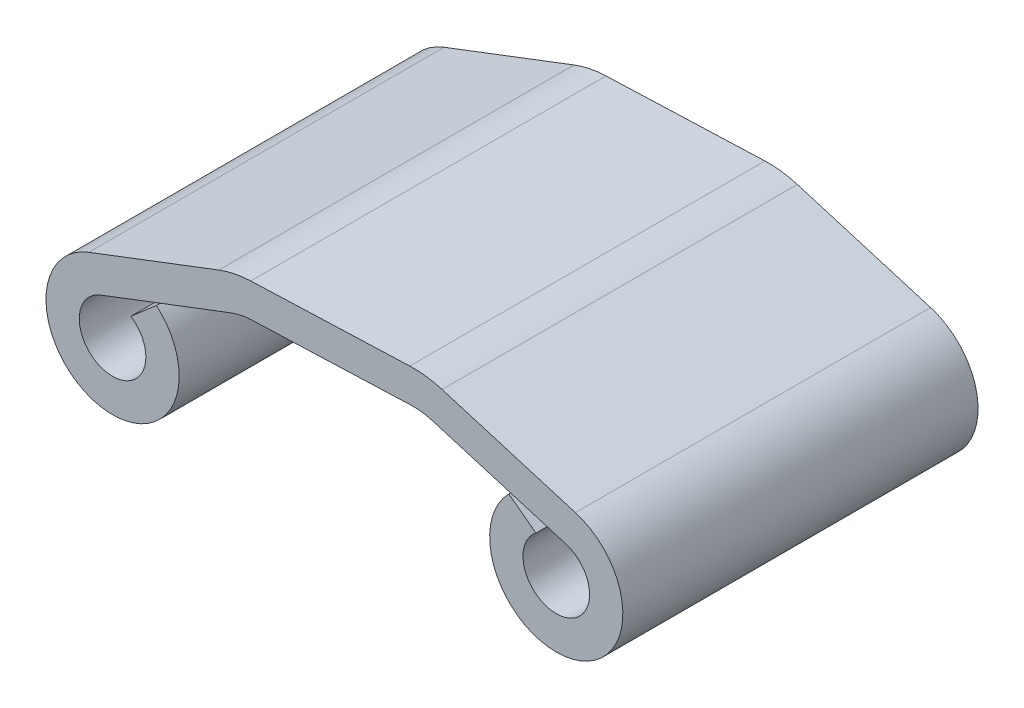
ISO-10303-21;
HEADER;
FILE_DESCRIPTION(('STEP AP214'),'2;1');
FILE_NAME('part.step','',(''),(''),'','','');
FILE_SCHEMA(('AUTOMOTIVE_DESIGN { 1 0 10303 214 1 1 1 1 }'));
ENDSEC;
DATA;
#1=APPLICATION_CONTEXT('core data for automotive mechanical design processes');
#2=APPLICATION_PROTOCOL_DEFINITION('international standard','automotive_design',2000,#1);
#3=PRODUCT_CONTEXT('',#1,'mechanical');
#4=PRODUCT('Part','Part','',(#3));
#5=PRODUCT_RELATED_PRODUCT_CATEGORY('part','',(#4));
#6=PRODUCT_DEFINITION_FORMATION('','',#4);
#7=PRODUCT_DEFINITION_CONTEXT('part definition',#1,'design');
#8=PRODUCT_DEFINITION('design','',#6,#7);
#9=PRODUCT_DEFINITION_SHAPE('','',#8);
#10=(LENGTH_UNIT() NAMED_UNIT(*) SI_UNIT(.MILLI.,.METRE.));
#11=(NAMED_UNIT(*) PLANE_ANGLE_UNIT() SI_UNIT($,.RADIAN.));
#12=(NAMED_UNIT(*) SI_UNIT($,.STERADIAN.) SOLID_ANGLE_UNIT());
#13=UNCERTAINTY_MEASURE_WITH_UNIT(LENGTH_MEASURE(1.E-05),#10,'distance_accuracy_value','');
#14=(GEOMETRIC_REPRESENTATION_CONTEXT(3) GLOBAL_UNCERTAINTY_ASSIGNED_CONTEXT((#13)) GLOBAL_UNIT_ASSIGNED_CONTEXT((#10,
#11,#12)) REPRESENTATION_CONTEXT('',''));
#15=CARTESIAN_POINT('',(0.,0.,0.));
#16=DIRECTION('',(0.,0.,1.));
#17=DIRECTION('',(1.,0.,0.));
#18=AXIS2_PLACEMENT_3D('',#15,#16,#17);
#19=CARTESIAN_POINT('',(-1.0702139979589,2.8026134229631,-8.));
#20=DIRECTION('',(-0.356737999319621,0.934204474321031,0.));
#21=DIRECTION('',(0.,0.,1.));
#22=AXIS2_PLACEMENT_3D('',#19,#20,#21);
#23=PLANE('',#22);
#24=DIRECTION('',(-0.934204474321031,-0.356737999319621,0.));
#25=VECTOR('',#24,1.);
#26=CARTESIAN_POINT('',(4.7854159190324,5.0386610536082,-8.));
#27=LINE('',#26,#25);
#28=CARTESIAN_POINT('',(4.7854159190324,5.0386610536082,-8.));
#29=VERTEX_POINT('',#28);
#30=CARTESIAN_POINT('',(-1.0702139979589,2.8026134229631,-8.));
#31=VERTEX_POINT('',#30);
#32=EDGE_CURVE('E129',#29,#31,#27,.T.);
#33=ORIENTED_EDGE('',*,*,#32,.T.);
#34=DIRECTION('',(0.,0.,1.));
#35=VECTOR('',#34,1.);
#36=CARTESIAN_POINT('',(-1.0702139979589,2.8026134229631,-8.));
#37=LINE('',#36,#35);
#38=CARTESIAN_POINT('',(-1.0702139979589,2.8026134229631,8.));
#39=VERTEX_POINT('',#38);
#40=EDGE_CURVE('E143',#39,#31,#37,.F.);
#41=ORIENTED_EDGE('',*,*,#40,.F.);
#42=DIRECTION('',(0.934204474321031,0.356737999319621,0.));
#43=VECTOR('',#42,1.);
#44=CARTESIAN_POINT('',(-1.0702139979589,2.8026134229631,8.));
#45=LINE('',#44,#43);
#46=CARTESIAN_POINT('',(4.7854159190324,5.0386610536082,8.));
#47=VERTEX_POINT('',#46);
#48=EDGE_CURVE('E149',#47,#39,#45,.F.);
#49=ORIENTED_EDGE('',*,*,#48,.F.);
#50=DIRECTION('',(0.,0.,-1.));
#51=VECTOR('',#50,1.);
#52=CARTESIAN_POINT('',(4.7854159190324,5.0386610536082,8.));
#53=LINE('',#52,#51);
#54=EDGE_CURVE('E137',#47,#29,#53,.T.);
#55=ORIENTED_EDGE('',*,*,#54,.T.);
#56=EDGE_LOOP('',(#33,#41,#49,#55));
#57=FACE_BOUND('',#56,.T.);
#58=ADVANCED_FACE('F17',(#57),#23,.T.);
#59=CARTESIAN_POINT('',(0.,0.,8.));
#60=DIRECTION('',(0.,0.,-1.));
#61=DIRECTION('',(-0.176928944739171,-0.98422362728878,0.));
#62=AXIS2_PLACEMENT_3D('',#59,#60,#61);
#63=CYLINDRICAL_SURFACE('',#62,3.);
#64=ORIENTED_EDGE('',*,*,#40,.T.);
#65=CARTESIAN_POINT('',(0.,0.,-8.));
#66=DIRECTION('',(0.,0.,1.));
#67=DIRECTION('',(-0.356737999319626,0.934204474321029,0.));
#68=AXIS2_PLACEMENT_3D('',#65,#66,#67);
#69=CIRCLE('',#68,3.);
#70=CARTESIAN_POINT('',(1.97929137598781,2.25441913781362,-8.));
#71=VERTEX_POINT('',#70);
#72=EDGE_CURVE('E127',#31,#71,#69,.T.);
#73=ORIENTED_EDGE('',*,*,#72,.T.);
#74=DIRECTION('',(0.,0.,1.));
#75=VECTOR('',#74,1.);
#76=CARTESIAN_POINT('',(1.97929137598781,2.25441913781362,-8.));
#77=LINE('',#76,#75);
#78=CARTESIAN_POINT('',(1.97929137598781,2.25441913781362,8.));
#79=VERTEX_POINT('',#78);
#80=EDGE_CURVE('E136',#79,#71,#77,.F.);
#81=ORIENTED_EDGE('',*,*,#80,.F.);
#82=CARTESIAN_POINT('',(0.,0.,8.));
#83=DIRECTION('',(0.,0.,-1.));
#84=DIRECTION('',(0.659763791995948,0.751473045937862,0.));
#85=AXIS2_PLACEMENT_3D('',#82,#83,#84);
#86=CIRCLE('',#85,3.);
#87=EDGE_CURVE('E148',#39,#79,#86,.F.);
#88=ORIENTED_EDGE('',*,*,#87,.F.);
#89=EDGE_LOOP('',(#64,#73,#81,#88));
#90=FACE_BOUND('',#89,.T.);
#91=ADVANCED_FACE('F147',(#90),#63,.T.);
#92=CARTESIAN_POINT('',(0.823823179143759,1.2535211882954,-8.));
#93=DIRECTION('',(-0.654740813717307,0.755853469167668,0.));
#94=DIRECTION('',(0.,0.,1.));
#95=AXIS2_PLACEMENT_3D('',#92,#93,#94);
#96=PLANE('',#95);
#97=DIRECTION('',(-0.755853469167668,-0.654740813717307,0.));
#98=VECTOR('',#97,1.);
#99=CARTESIAN_POINT('',(1.97929137598782,2.25441913781361,-8.));
#100=LINE('',#99,#98);
#101=CARTESIAN_POINT('',(0.823823179143759,1.2535211882954,-8.));
#102=VERTEX_POINT('',#101);
#103=EDGE_CURVE('E131',#71,#102,#100,.T.);
#104=ORIENTED_EDGE('',*,*,#103,.T.);
#105=DIRECTION('',(0.,0.,1.));
#106=VECTOR('',#105,1.);
#107=CARTESIAN_POINT('',(0.82382317914376,1.2535211882954,-8.));
#108=LINE('',#107,#106);
#109=CARTESIAN_POINT('',(0.82382317914376,1.2535211882954,8.));
#110=VERTEX_POINT('',#109);
#111=EDGE_CURVE('E171',#110,#102,#108,.F.);
#112=ORIENTED_EDGE('',*,*,#111,.F.);
#113=DIRECTION('',(0.755853469167668,0.654740813717307,0.));
#114=VECTOR('',#113,1.);
#115=CARTESIAN_POINT('',(0.823823179143759,1.2535211882954,8.));
#116=LINE('',#115,#114);
#117=EDGE_CURVE('E176',#79,#110,#116,.F.);
#118=ORIENTED_EDGE('',*,*,#117,.F.);
#119=ORIENTED_EDGE('',*,*,#80,.T.);
#120=EDGE_LOOP('',(#104,#112,#118,#119));
#121=FACE_BOUND('',#120,.T.);
#122=ADVANCED_FACE('F402',(#121),#96,.T.);
#123=CARTESIAN_POINT('',(0.,0.,8.));
#124=DIRECTION('',(0.,0.,-1.));
#125=DIRECTION('',(0.549215452762472,0.835680792196945,0.));
#126=AXIS2_PLACEMENT_3D('',#123,#124,#125);
#127=CYLINDRICAL_SURFACE('',#126,1.49999999999999);
#128=ORIENTED_EDGE('',*,*,#111,.T.);
#129=CARTESIAN_POINT('',(0.,0.,-8.));
#130=DIRECTION('',(0.,0.,-1.));
#131=DIRECTION('',(0.549215452762472,0.835680792196945,0.));
#132=AXIS2_PLACEMENT_3D('',#129,#130,#131);
#133=CIRCLE('',#132,1.49999999999999);
#134=CARTESIAN_POINT('',(-0.535106998979438,1.4013067114815,-8.));
#135=VERTEX_POINT('',#134);
#136=EDGE_CURVE('E180',#135,#102,#133,.F.);
#137=ORIENTED_EDGE('',*,*,#136,.F.);
#138=DIRECTION('',(0.,0.,1.));
#139=VECTOR('',#138,1.);
#140=CARTESIAN_POINT('',(-0.535106998979439,1.4013067114815,-8.));
#141=LINE('',#140,#139);
#142=CARTESIAN_POINT('',(-0.535106998979439,1.4013067114815,8.));
#143=VERTEX_POINT('',#142);
#144=EDGE_CURVE('E184',#143,#135,#141,.F.);
#145=ORIENTED_EDGE('',*,*,#144,.F.);
#146=CARTESIAN_POINT('',(0.,0.,8.));
#147=DIRECTION('',(0.,0.,1.));
#148=DIRECTION('',(-0.356737999319669,0.934204474321013,0.));
#149=AXIS2_PLACEMENT_3D('',#146,#147,#148);
#150=CIRCLE('',#149,1.49999999999999);
#151=EDGE_CURVE('E189',#143,#110,#150,.T.);
#152=ORIENTED_EDGE('',*,*,#151,.T.);
#153=EDGE_LOOP('',(#128,#137,#145,#152));
#154=FACE_BOUND('',#153,.T.);
#155=ADVANCED_FACE('F398',(#154),#127,.F.);
#156=CARTESIAN_POINT('',(5.3205229180119,3.6373543421267,-8.));
#157=DIRECTION('',(0.356737999319632,-0.934204474321027,0.));
#158=DIRECTION('',(0.,0.,1.));
#159=AXIS2_PLACEMENT_3D('',#156,#157,#158);
#160=PLANE('',#159);
#161=DIRECTION('',(0.934204474321027,0.356737999319632,0.));
#162=VECTOR('',#161,1.);
#163=CARTESIAN_POINT('',(-0.535106998979441,1.4013067114815,-8.));
#164=LINE('',#163,#162);
#165=CARTESIAN_POINT('',(5.3205229180119,3.6373543421267,-8.));
#166=VERTEX_POINT('',#165);
#167=EDGE_CURVE('E194',#135,#166,#164,.T.);
#168=ORIENTED_EDGE('',*,*,#167,.T.);
#169=DIRECTION('',(0.,0.,1.));
#170=VECTOR('',#169,1.);
#171=CARTESIAN_POINT('',(5.3205229180119,3.6373543421267,-8.));
#172=LINE('',#171,#170);
#173=CARTESIAN_POINT('',(5.3205229180119,3.6373543421267,8.));
#174=VERTEX_POINT('',#173);
#175=EDGE_CURVE('E199',#174,#166,#172,.F.);
#176=ORIENTED_EDGE('',*,*,#175,.F.);
#177=DIRECTION('',(-0.934204474321027,-0.356737999319632,0.));
#178=VECTOR('',#177,1.);
#179=CARTESIAN_POINT('',(5.3205229180119,3.6373543421267,8.));
#180=LINE('',#179,#178);
#181=EDGE_CURVE('E204',#143,#174,#180,.F.);
#182=ORIENTED_EDGE('',*,*,#181,.F.);
#183=ORIENTED_EDGE('',*,*,#144,.T.);
#184=EDGE_LOOP('',(#168,#176,#182,#183));
#185=FACE_BOUND('',#184,.T.);
#186=ADVANCED_FACE('F394',(#185),#160,.T.);
#187=CARTESIAN_POINT('',(6.39073691597074,0.834740919164091,8.));
#188=DIRECTION('',(0.,0.,-1.));
#189=DIRECTION('',(-0.356737999319668,0.934204474321013,0.));
#190=AXIS2_PLACEMENT_3D('',#187,#188,#189);
#191=CYLINDRICAL_SURFACE('',#190,2.99999999999954);
#192=CARTESIAN_POINT('',(6.39073691597074,0.834740919164091,-8.));
#193=DIRECTION('',(0.,0.,-1.));
#194=DIRECTION('',(-0.356737999319668,0.934204474321013,0.));
#195=AXIS2_PLACEMENT_3D('',#192,#193,#194);
#196=CIRCLE('',#195,2.99999999999954);
#197=CARTESIAN_POINT('',(6.2808057898511,3.8327261004996,-8.));
#198=VERTEX_POINT('',#197);
#199=EDGE_CURVE('E208',#198,#166,#196,.F.);
#200=ORIENTED_EDGE('',*,*,#199,.F.);
#201=DIRECTION('',(0.,0.,1.));
#202=VECTOR('',#201,1.);
#203=CARTESIAN_POINT('',(6.2808057898511,3.8327261004996,-8.));
#204=LINE('',#203,#202);
#205=CARTESIAN_POINT('',(6.2808057898511,3.8327261004996,8.));
#206=VERTEX_POINT('',#205);
#207=EDGE_CURVE('E212',#206,#198,#204,.F.);
#208=ORIENTED_EDGE('',*,*,#207,.F.);
#209=CARTESIAN_POINT('',(6.39073691597074,0.834740919164091,8.));
#210=DIRECTION('',(0.,0.,1.));
#211=DIRECTION('',(-0.0366437087065528,0.999328393778656,0.));
#212=AXIS2_PLACEMENT_3D('',#209,#210,#211);
#213=CIRCLE('',#212,2.99999999999954);
#214=EDGE_CURVE('E217',#206,#174,#213,.T.);
#215=ORIENTED_EDGE('',*,*,#214,.T.);
#216=ORIENTED_EDGE('',*,*,#175,.T.);
#217=EDGE_LOOP('',(#200,#208,#215,#216));
#218=FACE_BOUND('',#217,.T.);
#219=ADVANCED_FACE('F390',(#218),#191,.F.);
#220=CARTESIAN_POINT('',(13.441927383035,4.0953125088379,-8.));
#221=DIRECTION('',(0.0366437087065506,-0.999328393778656,0.));
#222=DIRECTION('',(0.,0.,1.));
#223=AXIS2_PLACEMENT_3D('',#220,#221,#222);
#224=PLANE('',#223);
#225=DIRECTION('',(0.999328393778656,0.0366437087065505,0.));
#226=VECTOR('',#225,1.);
#227=CARTESIAN_POINT('',(6.2808057898511,3.8327261004996,-8.));
#228=LINE('',#227,#226);
#229=CARTESIAN_POINT('',(13.441927383035,4.0953125088379,-8.));
#230=VERTEX_POINT('',#229);
#231=EDGE_CURVE('E222',#198,#230,#228,.T.);
#232=ORIENTED_EDGE('',*,*,#231,.T.);
#233=DIRECTION('',(0.,0.,1.));
#234=VECTOR('',#233,1.);
#235=CARTESIAN_POINT('',(13.441927383035,4.0953125088379,-8.));
#236=LINE('',#235,#234);
#237=CARTESIAN_POINT('',(13.441927383035,4.0953125088379,8.));
#238=VERTEX_POINT('',#237);
#239=EDGE_CURVE('E227',#238,#230,#236,.F.);
#240=ORIENTED_EDGE('',*,*,#239,.F.);
#241=DIRECTION('',(-0.999328393778656,-0.0366437087065505,0.));
#242=VECTOR('',#241,1.);
#243=CARTESIAN_POINT('',(13.441927383035,4.0953125088379,8.));
#244=LINE('',#243,#242);
#245=EDGE_CURVE('E232',#206,#238,#244,.F.);
#246=ORIENTED_EDGE('',*,*,#245,.F.);
#247=ORIENTED_EDGE('',*,*,#207,.T.);
#248=EDGE_LOOP('',(#232,#240,#246,#247));
#249=FACE_BOUND('',#248,.T.);
#250=ADVANCED_FACE('F386',(#249),#224,.T.);
#251=CARTESIAN_POINT('',(13.5518585091547,1.09732732750008,8.));
#252=DIRECTION('',(0.,0.,-1.));
#253=DIRECTION('',(-0.0366437087065305,0.999328393778657,0.));
#254=AXIS2_PLACEMENT_3D('',#251,#252,#253);
#255=CYLINDRICAL_SURFACE('',#254,3.00000000000185);
#256=CARTESIAN_POINT('',(13.5518585091547,1.09732732750008,-8.));
#257=DIRECTION('',(0.,0.,-1.));
#258=DIRECTION('',(-0.0366437087065302,0.999328393778657,0.));
#259=AXIS2_PLACEMENT_3D('',#256,#257,#258);
#260=CIRCLE('',#259,3.00000000000185);
#261=CARTESIAN_POINT('',(14.413940068704,3.97079481203789,-8.));
#262=VERTEX_POINT('',#261);
#263=EDGE_CURVE('E236',#262,#230,#260,.F.);
#264=ORIENTED_EDGE('',*,*,#263,.F.);
#265=DIRECTION('',(0.,0.,1.));
#266=VECTOR('',#265,1.);
#267=CARTESIAN_POINT('',(14.413940068704,3.97079481203789,-8.));
#268=LINE('',#267,#266);
#269=CARTESIAN_POINT('',(14.413940068704,3.9707948120379,8.));
#270=VERTEX_POINT('',#269);
#271=EDGE_CURVE('E240',#270,#262,#268,.F.);
#272=ORIENTED_EDGE('',*,*,#271,.F.);
#273=CARTESIAN_POINT('',(13.5518585091547,1.09732732750008,8.));
#274=DIRECTION('',(0.,0.,1.));
#275=DIRECTION('',(0.287360519849602,0.957822494845348,0.));
#276=AXIS2_PLACEMENT_3D('',#273,#274,#275);
#277=CIRCLE('',#276,3.00000000000185);
#278=EDGE_CURVE('E245',#270,#238,#277,.T.);
#279=ORIENTED_EDGE('',*,*,#278,.T.);
#280=ORIENTED_EDGE('',*,*,#239,.T.);
#281=EDGE_LOOP('',(#264,#272,#279,#280));
#282=FACE_BOUND('',#281,.T.);
#283=ADVANCED_FACE('F382',(#282),#255,.F.);
#284=CARTESIAN_POINT('',(20.417608655348,2.1696079163991,-8.));
#285=DIRECTION('',(-0.287360519849718,-0.957822494845313,0.));
#286=DIRECTION('',(0.,0.,1.));
#287=AXIS2_PLACEMENT_3D('',#284,#285,#286);
#288=PLANE('',#287);
#289=DIRECTION('',(0.957822494845313,-0.287360519849718,0.));
#290=VECTOR('',#289,1.);
#291=CARTESIAN_POINT('',(14.413940068704,3.9707948120379,-8.));
#292=LINE('',#291,#290);
#293=CARTESIAN_POINT('',(20.417608655348,2.1696079163991,-8.));
#294=VERTEX_POINT('',#293);
#295=EDGE_CURVE('E250',#262,#294,#292,.T.);
#296=ORIENTED_EDGE('',*,*,#295,.T.);
#297=DIRECTION('',(0.,0.,1.));
#298=VECTOR('',#297,1.);
#299=CARTESIAN_POINT('',(20.417608655348,2.1696079163991,-8.));
#300=LINE('',#299,#298);
#301=CARTESIAN_POINT('',(20.417608655348,2.1696079163991,8.));
#302=VERTEX_POINT('',#301);
#303=EDGE_CURVE('E255',#302,#294,#300,.F.);
#304=ORIENTED_EDGE('',*,*,#303,.F.);
#305=DIRECTION('',(-0.957822494845313,0.287360519849718,0.));
#306=VECTOR('',#305,1.);
#307=CARTESIAN_POINT('',(20.417608655348,2.1696079163991,8.));
#308=LINE('',#307,#306);
#309=EDGE_CURVE('E260',#270,#302,#308,.F.);
#310=ORIENTED_EDGE('',*,*,#309,.F.);
#311=ORIENTED_EDGE('',*,*,#271,.T.);
#312=EDGE_LOOP('',(#296,#304,#310,#311));
#313=FACE_BOUND('',#312,.T.);
#314=ADVANCED_FACE('F378',(#313),#288,.T.);
#315=CARTESIAN_POINT('',(19.9865678755733,0.732874174131207,8.));
#316=DIRECTION('',(0.,0.,-1.));
#317=DIRECTION('',(0.287360519849835,0.957822494845278,0.));
#318=AXIS2_PLACEMENT_3D('',#315,#316,#317);
#319=CYLINDRICAL_SURFACE('',#318,1.49999999999998);
#320=ORIENTED_EDGE('',*,*,#303,.T.);
#321=CARTESIAN_POINT('',(19.9865678755733,0.732874174131207,-8.));
#322=DIRECTION('',(0.,0.,-1.));
#323=DIRECTION('',(0.287360519849835,0.957822494845278,0.));
#324=AXIS2_PLACEMENT_3D('',#321,#322,#323);
#325=CIRCLE('',#324,1.49999999999998);
#326=CARTESIAN_POINT('',(19.073151460448,1.92269367833329,-8.));
#327=VERTEX_POINT('',#326);
#328=EDGE_CURVE('E264',#327,#294,#325,.F.);
#329=ORIENTED_EDGE('',*,*,#328,.F.);
#330=DIRECTION('',(0.,0.,1.));
#331=VECTOR('',#330,1.);
#332=CARTESIAN_POINT('',(19.073151460448,1.92269367833329,-8.));
#333=LINE('',#332,#331);
#334=CARTESIAN_POINT('',(19.073151460448,1.92269367833329,8.));
#335=VERTEX_POINT('',#334);
#336=EDGE_CURVE('E268',#335,#327,#333,.F.);
#337=ORIENTED_EDGE('',*,*,#336,.F.);
#338=CARTESIAN_POINT('',(19.9865678755733,0.732874174131207,8.));
#339=DIRECTION('',(0.,0.,1.));
#340=DIRECTION('',(-0.608944276750172,0.793213002801398,0.));
#341=AXIS2_PLACEMENT_3D('',#338,#339,#340);
#342=CIRCLE('',#341,1.49999999999998);
#343=EDGE_CURVE('E273',#335,#302,#342,.T.);
#344=ORIENTED_EDGE('',*,*,#343,.T.);
#345=EDGE_LOOP('',(#320,#329,#337,#344));
#346=FACE_BOUND('',#345,.T.);
#347=ADVANCED_FACE('F374',(#346),#319,.F.);
#348=CARTESIAN_POINT('',(17.847482338432,2.8362792860369,-8.));
#349=DIRECTION('',(0.597625146975629,0.801775644243674,0.));
#350=DIRECTION('',(0.,0.,1.));
#351=AXIS2_PLACEMENT_3D('',#348,#349,#350);
#352=PLANE('',#351);
#353=DIRECTION('',(-0.801775644243674,0.597625146975629,0.));
#354=VECTOR('',#353,1.);
#355=CARTESIAN_POINT('',(19.073151460448,1.92269367833329,-8.));
#356=LINE('',#355,#354);
#357=CARTESIAN_POINT('',(17.847482338432,2.8362792860369,-8.));
#358=VERTEX_POINT('',#357);
#359=EDGE_CURVE('E278',#327,#358,#356,.T.);
#360=ORIENTED_EDGE('',*,*,#359,.T.);
#361=DIRECTION('',(0.,0.,1.));
#362=VECTOR('',#361,1.);
#363=CARTESIAN_POINT('',(17.847482338432,2.8362792860369,-8.));
#364=LINE('',#363,#362);
#365=CARTESIAN_POINT('',(17.847482338432,2.8362792860369,8.));
#366=VERTEX_POINT('',#365);
#367=EDGE_CURVE('E283',#366,#358,#364,.F.);
#368=ORIENTED_EDGE('',*,*,#367,.F.);
#369=DIRECTION('',(0.801775644243674,-0.597625146975628,0.));
#370=VECTOR('',#369,1.);
#371=CARTESIAN_POINT('',(17.847482338432,2.8362792860369,8.));
#372=LINE('',#371,#370);
#373=EDGE_CURVE('E288',#335,#366,#372,.F.);
#374=ORIENTED_EDGE('',*,*,#373,.F.);
#375=ORIENTED_EDGE('',*,*,#336,.T.);
#376=EDGE_LOOP('',(#360,#368,#374,#375));
#377=FACE_BOUND('',#376,.T.);
#378=ADVANCED_FACE('F370',(#377),#352,.T.);
#379=CARTESIAN_POINT('',(19.9865678755734,0.732874174131168,8.));
#380=DIRECTION('',(0.,0.,-1.));
#381=DIRECTION('',(0.248536632203467,-0.968622497391506,0.));
#382=AXIS2_PLACEMENT_3D('',#379,#380,#381);
#383=CYLINDRICAL_SURFACE('',#382,2.99999999999981);
#384=ORIENTED_EDGE('',*,*,#367,.T.);
#385=CARTESIAN_POINT('',(19.9865678755734,0.732874174131168,-8.));
#386=DIRECTION('',(0.,0.,1.));
#387=DIRECTION('',(-0.713028512380527,0.701135037301954,0.));
#388=AXIS2_PLACEMENT_3D('',#385,#386,#387);
#389=CIRCLE('',#388,2.99999999999981);
#390=CARTESIAN_POINT('',(20.848649435122,3.60634165866709,-8.));
#391=VERTEX_POINT('',#390);
#392=EDGE_CURVE('E292',#358,#391,#389,.T.);
#393=ORIENTED_EDGE('',*,*,#392,.T.);
#394=DIRECTION('',(0.,0.,1.));
#395=VECTOR('',#394,1.);
#396=CARTESIAN_POINT('',(20.848649435122,3.60634165866709,-8.));
#397=LINE('',#396,#395);
#398=CARTESIAN_POINT('',(20.848649435122,3.60634165866709,8.));
#399=VERTEX_POINT('',#398);
#400=EDGE_CURVE('E297',#399,#391,#397,.F.);
#401=ORIENTED_EDGE('',*,*,#400,.F.);
#402=CARTESIAN_POINT('',(19.9865678755734,0.732874174131168,8.));
#403=DIRECTION('',(0.,0.,-1.));
#404=DIRECTION('',(0.287360519849535,0.957822494845368,0.));
#405=AXIS2_PLACEMENT_3D('',#402,#403,#404);
#406=CIRCLE('',#405,2.99999999999981);
#407=EDGE_CURVE('E302',#366,#399,#406,.F.);
#408=ORIENTED_EDGE('',*,*,#407,.F.);
#409=EDGE_LOOP('',(#384,#393,#401,#408));
#410=FACE_BOUND('',#409,.T.);
#411=ADVANCED_FACE('F365',(#410),#383,.T.);
#412=CARTESIAN_POINT('',(14.844980848478,5.4075285543058,-8.));
#413=DIRECTION('',(0.287360519849703,0.957822494845318,0.));
#414=DIRECTION('',(0.,0.,1.));
#415=AXIS2_PLACEMENT_3D('',#412,#413,#414);
#416=PLANE('',#415);
#417=DIRECTION('',(-0.957822494845318,0.287360519849703,0.));
#418=VECTOR('',#417,1.);
#419=CARTESIAN_POINT('',(20.848649435122,3.6063416586671,-8.));
#420=LINE('',#419,#418);
#421=CARTESIAN_POINT('',(14.844980848478,5.4075285543058,-8.));
#422=VERTEX_POINT('',#421);
#423=EDGE_CURVE('E306',#391,#422,#420,.T.);
#424=ORIENTED_EDGE('',*,*,#423,.T.);
#425=DIRECTION('',(0.,0.,1.));
#426=VECTOR('',#425,1.);
#427=CARTESIAN_POINT('',(14.844980848478,5.4075285543058,-8.));
#428=LINE('',#427,#426);
#429=CARTESIAN_POINT('',(14.844980848478,5.4075285543058,8.));
#430=VERTEX_POINT('',#429);
#431=EDGE_CURVE('E311',#430,#422,#428,.F.);
#432=ORIENTED_EDGE('',*,*,#431,.F.);
#433=DIRECTION('',(0.957822494845317,-0.287360519849703,0.));
#434=VECTOR('',#433,1.);
#435=CARTESIAN_POINT('',(14.844980848478,5.4075285543058,8.));
#436=LINE('',#435,#434);
#437=EDGE_CURVE('E316',#399,#430,#436,.F.);
#438=ORIENTED_EDGE('',*,*,#437,.F.);
#439=ORIENTED_EDGE('',*,*,#400,.T.);
#440=EDGE_LOOP('',(#424,#432,#438,#439));
#441=FACE_BOUND('',#440,.T.);
#442=ADVANCED_FACE('F362',(#441),#416,.T.);
#443=CARTESIAN_POINT('',(13.5518585091554,1.09732732751187,8.));
#444=DIRECTION('',(0.,0.,-1.));
#445=DIRECTION('',(-0.0366437087068359,0.999328393778646,0.));
#446=AXIS2_PLACEMENT_3D('',#443,#444,#445);
#447=CYLINDRICAL_SURFACE('',#446,4.49999999999012);
#448=CARTESIAN_POINT('',(13.5518585091554,1.09732732751187,-8.));
#449=DIRECTION('',(0.,0.,1.));
#450=DIRECTION('',(0.287360519850098,0.957822494845199,0.));
#451=AXIS2_PLACEMENT_3D('',#448,#449,#450);
#452=CIRCLE('',#451,4.49999999999012);
#453=CARTESIAN_POINT('',(13.386961819975,5.5943050995059,-8.));
#454=VERTEX_POINT('',#453);
#455=EDGE_CURVE('E320',#422,#454,#452,.T.);
#456=ORIENTED_EDGE('',*,*,#455,.T.);
#457=DIRECTION('',(0.,0.,1.));
#458=VECTOR('',#457,1.);
#459=CARTESIAN_POINT('',(13.386961819975,5.5943050995059,-8.));
#460=LINE('',#459,#458);
#461=CARTESIAN_POINT('',(13.386961819975,5.5943050995059,8.));
#462=VERTEX_POINT('',#461);
#463=EDGE_CURVE('E325',#462,#454,#460,.F.);
#464=ORIENTED_EDGE('',*,*,#463,.F.);
#465=CARTESIAN_POINT('',(13.5518585091554,1.09732732751187,8.));
#466=DIRECTION('',(0.,0.,-1.));
#467=DIRECTION('',(-0.0366437087068354,0.999328393778646,0.));
#468=AXIS2_PLACEMENT_3D('',#465,#466,#467);
#469=CIRCLE('',#468,4.49999999999012);
#470=EDGE_CURVE('E330',#430,#462,#469,.F.);
#471=ORIENTED_EDGE('',*,*,#470,.F.);
#472=ORIENTED_EDGE('',*,*,#431,.T.);
#473=EDGE_LOOP('',(#456,#464,#471,#472));
#474=FACE_BOUND('',#473,.T.);
#475=ADVANCED_FACE('F357',(#474),#447,.T.);
#476=CARTESIAN_POINT('',(6.2258402267912,5.3317186911675,-8.));
#477=DIRECTION('',(-0.0366437087065649,0.999328393778656,0.));
#478=DIRECTION('',(0.,0.,1.));
#479=AXIS2_PLACEMENT_3D('',#476,#477,#478);
#480=PLANE('',#479);
#481=DIRECTION('',(-0.999328393778656,-0.036643708706565,0.));
#482=VECTOR('',#481,1.);
#483=CARTESIAN_POINT('',(13.386961819975,5.5943050995059,-8.));
#484=LINE('',#483,#482);
#485=CARTESIAN_POINT('',(6.2258402267912,5.3317186911675,-8.));
#486=VERTEX_POINT('',#485);
#487=EDGE_CURVE('E334',#454,#486,#484,.T.);
#488=ORIENTED_EDGE('',*,*,#487,.T.);
#489=DIRECTION('',(0.,0.,1.));
#490=VECTOR('',#489,1.);
#491=CARTESIAN_POINT('',(6.2258402267912,5.3317186911675,-8.));
#492=LINE('',#491,#490);
#493=CARTESIAN_POINT('',(6.2258402267912,5.3317186911675,8.));
#494=VERTEX_POINT('',#493);
#495=EDGE_CURVE('E338',#494,#486,#492,.F.);
#496=ORIENTED_EDGE('',*,*,#495,.F.);
#497=DIRECTION('',(0.999328393778656,0.036643708706565,0.));
#498=VECTOR('',#497,1.);
#499=CARTESIAN_POINT('',(6.2258402267912,5.3317186911675,8.));
#500=LINE('',#499,#498);
#501=EDGE_CURVE('E32',#462,#494,#500,.F.);
#502=ORIENTED_EDGE('',*,*,#501,.F.);
#503=ORIENTED_EDGE('',*,*,#463,.T.);
#504=EDGE_LOOP('',(#488,#496,#502,#503));
#505=FACE_BOUND('',#504,.T.);
#506=ADVANCED_FACE('F354',(#505),#480,.T.);
#507=CARTESIAN_POINT('',(6.39073691597072,0.834740919163213,8.));
#508=DIRECTION('',(0.,0.,-1.));
#509=DIRECTION('',(-0.3567379993196,0.934204474321039,0.));
#510=AXIS2_PLACEMENT_3D('',#507,#508,#509);
#511=CYLINDRICAL_SURFACE('',#510,4.50000000000034);
#512=CARTESIAN_POINT('',(6.39073691597072,0.834740919163213,-8.));
#513=DIRECTION('',(0.,0.,1.));
#514=DIRECTION('',(-0.0366437087065567,0.999328393778656,0.));
#515=AXIS2_PLACEMENT_3D('',#512,#513,#514);
#516=CIRCLE('',#515,4.50000000000034);
#517=EDGE_CURVE('E26',#486,#29,#516,.T.);
#518=ORIENTED_EDGE('',*,*,#517,.T.);
#519=ORIENTED_EDGE('',*,*,#54,.F.);
#520=CARTESIAN_POINT('',(6.39073691597072,0.834740919163213,8.));
#521=DIRECTION('',(0.,0.,-1.));
#522=DIRECTION('',(-0.3567379993196,0.934204474321039,0.));
#523=AXIS2_PLACEMENT_3D('',#520,#521,#522);
#524=CIRCLE('',#523,4.50000000000034);
#525=EDGE_CURVE('E11',#494,#47,#524,.F.);
#526=ORIENTED_EDGE('',*,*,#525,.F.);
#527=ORIENTED_EDGE('',*,*,#495,.T.);
#528=EDGE_LOOP('',(#518,#519,#526,#527));
#529=FACE_BOUND('',#528,.T.);
#530=ADVANCED_FACE('F351',(#529),#511,.T.);
#531=CARTESIAN_POINT('',(-3.23614244990355,-3.00792561502788,8.));
#532=DIRECTION('',(0.,0.,1.));
#533=DIRECTION('',(1.,0.,0.));
#534=AXIS2_PLACEMENT_3D('',#531,#532,#533);
#535=PLANE('',#534);
#536=ORIENTED_EDGE('',*,*,#48,.T.);
#537=ORIENTED_EDGE('',*,*,#87,.T.);
#538=ORIENTED_EDGE('',*,*,#117,.T.);
#539=ORIENTED_EDGE('',*,*,#151,.F.);
#540=ORIENTED_EDGE('',*,*,#181,.T.);
#541=ORIENTED_EDGE('',*,*,#214,.F.);
#542=ORIENTED_EDGE('',*,*,#245,.T.);
#543=ORIENTED_EDGE('',*,*,#278,.F.);
#544=ORIENTED_EDGE('',*,*,#309,.T.);
#545=ORIENTED_EDGE('',*,*,#343,.F.);
#546=ORIENTED_EDGE('',*,*,#373,.T.);
#547=ORIENTED_EDGE('',*,*,#407,.T.);
#548=ORIENTED_EDGE('',*,*,#437,.T.);
#549=ORIENTED_EDGE('',*,*,#470,.T.);
#550=ORIENTED_EDGE('',*,*,#501,.T.);
#551=ORIENTED_EDGE('',*,*,#525,.T.);
#552=EDGE_LOOP('',(#536,#537,#538,#539,#540,#541,#542,#543,#544,#545,#546,#547,#548,#549,#550,#551));
#553=FACE_BOUND('',#552,.T.);
#554=ADVANCED_FACE('F403',(#553),#535,.T.);
#555=CARTESIAN_POINT('',(-3.34330003126312,-3.00324204993301,-8.));
#556=DIRECTION('',(0.,0.,-1.));
#557=DIRECTION('',(0.,1.,0.));
#558=AXIS2_PLACEMENT_3D('',#555,#556,#557);
#559=PLANE('',#558);
#560=ORIENTED_EDGE('',*,*,#72,.F.);
#561=ORIENTED_EDGE('',*,*,#32,.F.);
#562=ORIENTED_EDGE('',*,*,#517,.F.);
#563=ORIENTED_EDGE('',*,*,#487,.F.);
#564=ORIENTED_EDGE('',*,*,#455,.F.);
#565=ORIENTED_EDGE('',*,*,#423,.F.);
#566=ORIENTED_EDGE('',*,*,#392,.F.);
#567=ORIENTED_EDGE('',*,*,#359,.F.);
#568=ORIENTED_EDGE('',*,*,#328,.T.);
#569=ORIENTED_EDGE('',*,*,#295,.F.);
#570=ORIENTED_EDGE('',*,*,#263,.T.);
#571=ORIENTED_EDGE('',*,*,#231,.F.);
#572=ORIENTED_EDGE('',*,*,#199,.T.);
#573=ORIENTED_EDGE('',*,*,#167,.F.);
#574=ORIENTED_EDGE('',*,*,#136,.T.);
#575=ORIENTED_EDGE('',*,*,#103,.F.);
#576=EDGE_LOOP('',(#560,#561,#562,#563,#564,#565,#566,#567,#568,#569,#570,#571,#572,#573,#574,#575));
#577=FACE_BOUND('',#576,.T.);
#578=ADVANCED_FACE('F19',(#577),#559,.T.);
#579=CLOSED_SHELL('',(#58,#91,#122,#155,#186,#219,#250,#283,#314,#347,#378,#411,#442,#475,#506,
#530,#554,#578));
#580=MANIFOLD_SOLID_BREP('B1',#579);
#581=ADVANCED_BREP_SHAPE_REPRESENTATION('',(#18,#580),#14);
#582=SHAPE_DEFINITION_REPRESENTATION(#9,#581);
ENDSEC;
END-ISO-10303-21;
